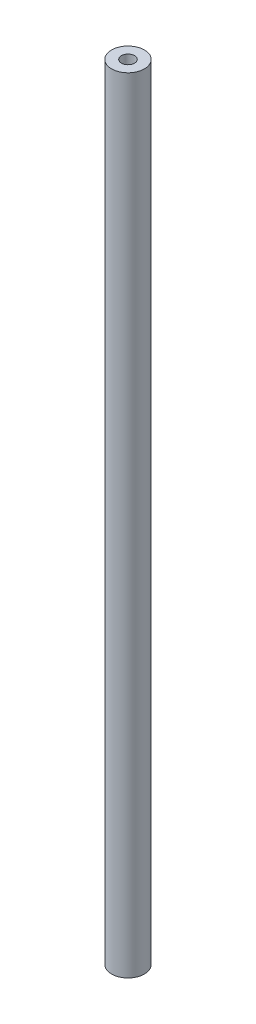
ISO-10303-21;
HEADER;
FILE_DESCRIPTION(('STEP AP214'),'2;1');
FILE_NAME('part.step','',(''),(''),'','','');
FILE_SCHEMA(('AUTOMOTIVE_DESIGN { 1 0 10303 214 1 1 1 1 }'));
ENDSEC;
DATA;
#1=APPLICATION_CONTEXT('core data for automotive mechanical design processes');
#2=APPLICATION_PROTOCOL_DEFINITION('international standard','automotive_design',2000,#1);
#3=PRODUCT_CONTEXT('',#1,'mechanical');
#4=PRODUCT('Part','Part','',(#3));
#5=PRODUCT_RELATED_PRODUCT_CATEGORY('part','',(#4));
#6=PRODUCT_DEFINITION_FORMATION('','',#4);
#7=PRODUCT_DEFINITION_CONTEXT('part definition',#1,'design');
#8=PRODUCT_DEFINITION('design','',#6,#7);
#9=PRODUCT_DEFINITION_SHAPE('','',#8);
#10=(LENGTH_UNIT() NAMED_UNIT(*) SI_UNIT(.MILLI.,.METRE.));
#11=(NAMED_UNIT(*) PLANE_ANGLE_UNIT() SI_UNIT($,.RADIAN.));
#12=(NAMED_UNIT(*) SI_UNIT($,.STERADIAN.) SOLID_ANGLE_UNIT());
#13=UNCERTAINTY_MEASURE_WITH_UNIT(LENGTH_MEASURE(1.E-05),#10,'distance_accuracy_value','');
#14=(GEOMETRIC_REPRESENTATION_CONTEXT(3) GLOBAL_UNCERTAINTY_ASSIGNED_CONTEXT((#13)) GLOBAL_UNIT_ASSIGNED_CONTEXT((#10,
#11,#12)) REPRESENTATION_CONTEXT('',''));
#15=CARTESIAN_POINT('',(0.,0.,0.));
#16=DIRECTION('',(0.,0.,1.));
#17=DIRECTION('',(1.,0.,0.));
#18=AXIS2_PLACEMENT_3D('',#15,#16,#17);
#19=CARTESIAN_POINT('',(0.,238.84,0.));
#20=DIRECTION('',(0.,-1.,0.));
#21=DIRECTION('',(0.,0.,-1.));
#22=AXIS2_PLACEMENT_3D('',#19,#20,#21);
#23=CYLINDRICAL_SURFACE('',#22,5.);
#24=CARTESIAN_POINT('',(0.,238.84,0.));
#25=DIRECTION('',(0.,1.,0.));
#26=DIRECTION('',(0.,0.,1.));
#27=AXIS2_PLACEMENT_3D('',#24,#25,#26);
#28=CIRCLE('',#27,5.);
#29=CARTESIAN_POINT('',(0.,238.84,5.));
#30=VERTEX_POINT('',#29);
#31=EDGE_CURVE('E10',#30,#30,#28,.T.);
#32=ORIENTED_EDGE('',*,*,#31,.F.);
#33=EDGE_LOOP('',(#32));
#34=FACE_BOUND('',#33,.T.);
#35=CARTESIAN_POINT('',(0.,0.,0.));
#36=DIRECTION('',(0.,1.,0.));
#37=DIRECTION('',(0.,0.,1.));
#38=AXIS2_PLACEMENT_3D('',#35,#36,#37);
#39=CIRCLE('',#38,5.);
#40=CARTESIAN_POINT('',(0.,0.,5.));
#41=VERTEX_POINT('',#40);
#42=EDGE_CURVE('E40',#41,#41,#39,.T.);
#43=ORIENTED_EDGE('',*,*,#42,.T.);
#44=EDGE_LOOP('',(#43));
#45=FACE_BOUND('',#44,.T.);
#46=ADVANCED_FACE('F37',(#34,#45),#23,.T.);
#47=CARTESIAN_POINT('',(0.,238.84,0.));
#48=DIRECTION('',(0.,1.,0.));
#49=DIRECTION('',(0.,0.,1.));
#50=AXIS2_PLACEMENT_3D('',#47,#48,#49);
#51=PLANE('',#50);
#52=CARTESIAN_POINT('',(0.,238.84,0.));
#53=DIRECTION('',(0.,1.,0.));
#54=DIRECTION('',(0.,0.,1.));
#55=AXIS2_PLACEMENT_3D('',#52,#53,#54);
#56=CIRCLE('',#55,2.);
#57=CARTESIAN_POINT('',(0.,238.84,2.));
#58=VERTEX_POINT('',#57);
#59=EDGE_CURVE('E51',#58,#58,#56,.T.);
#60=ORIENTED_EDGE('',*,*,#59,.F.);
#61=EDGE_LOOP('',(#60));
#62=FACE_BOUND('',#61,.T.);
#63=ORIENTED_EDGE('',*,*,#31,.T.);
#64=EDGE_LOOP('',(#63));
#65=FACE_BOUND('',#64,.T.);
#66=ADVANCED_FACE('F80',(#62,#65),#51,.T.);
#67=CARTESIAN_POINT('',(0.,0.,0.));
#68=DIRECTION('',(0.,1.,0.));
#69=DIRECTION('',(0.,0.,1.));
#70=AXIS2_PLACEMENT_3D('',#67,#68,#69);
#71=PLANE('',#70);
#72=CARTESIAN_POINT('',(0.,0.,0.));
#73=DIRECTION('',(0.,-1.,0.));
#74=DIRECTION('',(0.,0.,-1.));
#75=AXIS2_PLACEMENT_3D('',#72,#73,#74);
#76=CIRCLE('',#75,2.);
#77=CARTESIAN_POINT('',(0.,0.,-2.));
#78=VERTEX_POINT('',#77);
#79=EDGE_CURVE('E59',#78,#78,#76,.T.);
#80=ORIENTED_EDGE('',*,*,#79,.F.);
#81=EDGE_LOOP('',(#80));
#82=FACE_BOUND('',#81,.T.);
#83=ORIENTED_EDGE('',*,*,#42,.F.);
#84=EDGE_LOOP('',(#83));
#85=FACE_BOUND('',#84,.T.);
#86=ADVANCED_FACE('F76',(#82,#85),#71,.F.);
#87=CARTESIAN_POINT('',(0.,228.84,0.));
#88=DIRECTION('',(0.,1.,0.));
#89=DIRECTION('',(0.,0.,1.));
#90=AXIS2_PLACEMENT_3D('',#87,#88,#89);
#91=CYLINDRICAL_SURFACE('',#90,2.);
#92=CARTESIAN_POINT('',(0.,228.84,0.));
#93=DIRECTION('',(0.,1.,0.));
#94=DIRECTION('',(0.,0.,1.));
#95=AXIS2_PLACEMENT_3D('',#92,#93,#94);
#96=CIRCLE('',#95,2.);
#97=CARTESIAN_POINT('',(0.,228.84,2.));
#98=VERTEX_POINT('',#97);
#99=EDGE_CURVE('E49',#98,#98,#96,.T.);
#100=ORIENTED_EDGE('',*,*,#99,.F.);
#101=EDGE_LOOP('',(#100));
#102=FACE_BOUND('',#101,.T.);
#103=ORIENTED_EDGE('',*,*,#59,.T.);
#104=EDGE_LOOP('',(#103));
#105=FACE_BOUND('',#104,.T.);
#106=ADVANCED_FACE('F79',(#102,#105),#91,.F.);
#107=CARTESIAN_POINT('',(0.,228.84,0.));
#108=DIRECTION('',(0.,1.,0.));
#109=DIRECTION('',(0.,0.,1.));
#110=AXIS2_PLACEMENT_3D('',#107,#108,#109);
#111=PLANE('',#110);
#112=ORIENTED_EDGE('',*,*,#99,.T.);
#113=EDGE_LOOP('',(#112));
#114=FACE_BOUND('',#113,.T.);
#115=ADVANCED_FACE('F72',(#114),#111,.T.);
#116=CARTESIAN_POINT('',(0.,10.,0.));
#117=DIRECTION('',(0.,-1.,0.));
#118=DIRECTION('',(0.,0.,-1.));
#119=AXIS2_PLACEMENT_3D('',#116,#117,#118);
#120=CYLINDRICAL_SURFACE('',#119,2.);
#121=CARTESIAN_POINT('',(0.,10.,0.));
#122=DIRECTION('',(0.,-1.,0.));
#123=DIRECTION('',(0.,0.,-1.));
#124=AXIS2_PLACEMENT_3D('',#121,#122,#123);
#125=CIRCLE('',#124,2.);
#126=CARTESIAN_POINT('',(0.,10.,-2.));
#127=VERTEX_POINT('',#126);
#128=EDGE_CURVE('E55',#127,#127,#125,.T.);
#129=ORIENTED_EDGE('',*,*,#128,.F.);
#130=EDGE_LOOP('',(#129));
#131=FACE_BOUND('',#130,.T.);
#132=ORIENTED_EDGE('',*,*,#79,.T.);
#133=EDGE_LOOP('',(#132));
#134=FACE_BOUND('',#133,.T.);
#135=ADVANCED_FACE('F69',(#131,#134),#120,.F.);
#136=CARTESIAN_POINT('',(0.,10.,0.));
#137=DIRECTION('',(0.,-1.,0.));
#138=DIRECTION('',(0.,0.,-1.));
#139=AXIS2_PLACEMENT_3D('',#136,#137,#138);
#140=PLANE('',#139);
#141=ORIENTED_EDGE('',*,*,#128,.T.);
#142=EDGE_LOOP('',(#141));
#143=FACE_BOUND('',#142,.T.);
#144=ADVANCED_FACE('F67',(#143),#140,.T.);
#145=CLOSED_SHELL('',(#46,#66,#86,#106,#115,#135,#144));
#146=MANIFOLD_SOLID_BREP('B2',#145);
#147=ADVANCED_BREP_SHAPE_REPRESENTATION('',(#18,#146),#14);
#148=SHAPE_DEFINITION_REPRESENTATION(#9,#147);
ENDSEC;
END-ISO-10303-21;
